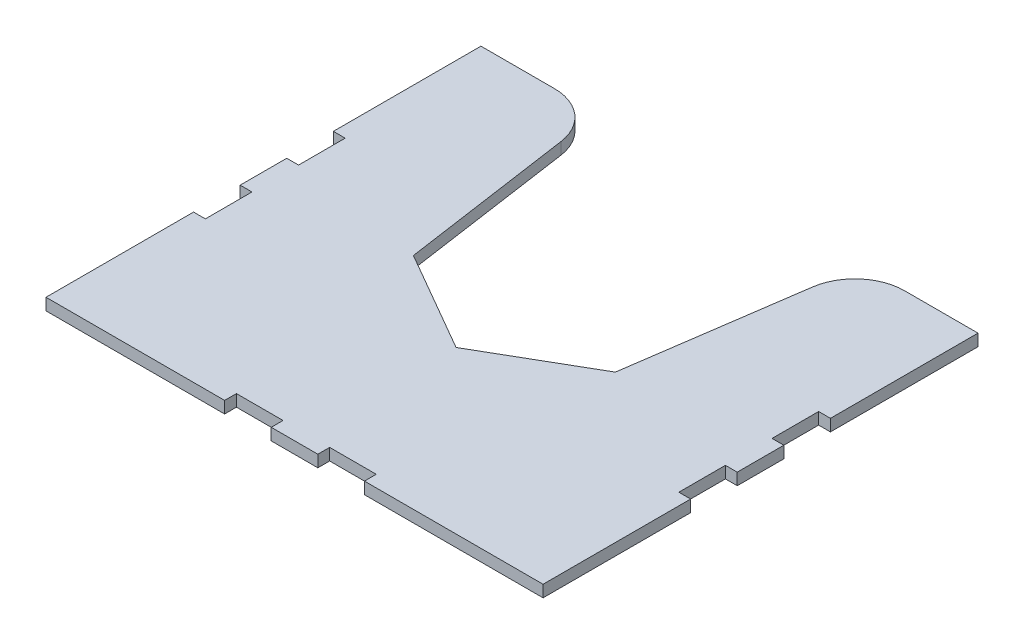
ISO-10303-21;
HEADER;
FILE_DESCRIPTION(('STEP AP214'),'2;1');
FILE_NAME('part.step','',(''),(''),'','','');
FILE_SCHEMA(('AUTOMOTIVE_DESIGN { 1 0 10303 214 1 1 1 1 }'));
ENDSEC;
DATA;
#1=APPLICATION_CONTEXT('core data for automotive mechanical design processes');
#2=APPLICATION_PROTOCOL_DEFINITION('international standard','automotive_design',2000,#1);
#3=PRODUCT_CONTEXT('',#1,'mechanical');
#4=PRODUCT('Part','Part','',(#3));
#5=PRODUCT_RELATED_PRODUCT_CATEGORY('part','',(#4));
#6=PRODUCT_DEFINITION_FORMATION('','',#4);
#7=PRODUCT_DEFINITION_CONTEXT('part definition',#1,'design');
#8=PRODUCT_DEFINITION('design','',#6,#7);
#9=PRODUCT_DEFINITION_SHAPE('','',#8);
#10=(LENGTH_UNIT() NAMED_UNIT(*) SI_UNIT(.MILLI.,.METRE.));
#11=(NAMED_UNIT(*) PLANE_ANGLE_UNIT() SI_UNIT($,.RADIAN.));
#12=(NAMED_UNIT(*) SI_UNIT($,.STERADIAN.) SOLID_ANGLE_UNIT());
#13=UNCERTAINTY_MEASURE_WITH_UNIT(LENGTH_MEASURE(1.E-05),#10,'distance_accuracy_value','');
#14=(GEOMETRIC_REPRESENTATION_CONTEXT(3) GLOBAL_UNCERTAINTY_ASSIGNED_CONTEXT((#13)) GLOBAL_UNIT_ASSIGNED_CONTEXT((#10,
#11,#12)) REPRESENTATION_CONTEXT('',''));
#15=CARTESIAN_POINT('',(0.,0.,0.));
#16=DIRECTION('',(0.,0.,1.));
#17=DIRECTION('',(1.,0.,0.));
#18=AXIS2_PLACEMENT_3D('',#15,#16,#17);
#19=CARTESIAN_POINT('',(0.,4.826,0.));
#20=DIRECTION('',(0.,0.,-1.));
#21=DIRECTION('',(-1.,0.,0.));
#22=AXIS2_PLACEMENT_3D('',#19,#20,#21);
#23=PLANE('',#22);
#24=DIRECTION('',(1.,0.,0.));
#25=VECTOR('',#24,1.);
#26=CARTESIAN_POINT('',(0.,0.,0.));
#27=LINE('',#26,#25);
#28=CARTESIAN_POINT('',(92.075,0.,0.));
#29=VERTEX_POINT('',#28);
#30=CARTESIAN_POINT('',(111.125,0.,0.));
#31=VERTEX_POINT('',#30);
#32=EDGE_CURVE('E274',#29,#31,#27,.T.);
#33=ORIENTED_EDGE('',*,*,#32,.T.);
#34=DIRECTION('',(0.,1.,0.));
#35=VECTOR('',#34,1.);
#36=CARTESIAN_POINT('',(111.125,0.,0.));
#37=LINE('',#36,#35);
#38=CARTESIAN_POINT('',(111.125,4.826,0.));
#39=VERTEX_POINT('',#38);
#40=EDGE_CURVE('E258',#31,#39,#37,.T.);
#41=ORIENTED_EDGE('',*,*,#40,.T.);
#42=DIRECTION('',(1.,0.,0.));
#43=VECTOR('',#42,1.);
#44=CARTESIAN_POINT('',(0.,4.826,0.));
#45=LINE('',#44,#43);
#46=CARTESIAN_POINT('',(92.075,4.826,0.));
#47=VERTEX_POINT('',#46);
#48=EDGE_CURVE('E369',#47,#39,#45,.T.);
#49=ORIENTED_EDGE('',*,*,#48,.F.);
#50=DIRECTION('',(0.,1.,0.));
#51=VECTOR('',#50,1.);
#52=CARTESIAN_POINT('',(92.075,0.,0.));
#53=LINE('',#52,#51);
#54=EDGE_CURVE('E280',#29,#47,#53,.T.);
#55=ORIENTED_EDGE('',*,*,#54,.F.);
#56=EDGE_LOOP('',(#33,#41,#49,#55));
#57=FACE_BOUND('',#56,.T.);
#58=ADVANCED_FACE('F32',(#57),#23,.F.);
#59=CARTESIAN_POINT('',(0.,0.,0.));
#60=VERTEX_POINT('',#59);
#61=CARTESIAN_POINT('',(73.025,0.,0.));
#62=VERTEX_POINT('',#61);
#63=EDGE_CURVE('E281',#60,#62,#27,.T.);
#64=ORIENTED_EDGE('',*,*,#63,.T.);
#65=DIRECTION('',(0.,1.,0.));
#66=VECTOR('',#65,1.);
#67=CARTESIAN_POINT('',(73.025,0.,0.));
#68=LINE('',#67,#66);
#69=CARTESIAN_POINT('',(73.025,4.826,0.));
#70=VERTEX_POINT('',#69);
#71=EDGE_CURVE('E462',#62,#70,#68,.T.);
#72=ORIENTED_EDGE('',*,*,#71,.T.);
#73=CARTESIAN_POINT('',(0.,4.826,0.));
#74=VERTEX_POINT('',#73);
#75=EDGE_CURVE('E365',#74,#70,#45,.T.);
#76=ORIENTED_EDGE('',*,*,#75,.F.);
#77=DIRECTION('',(0.,-1.,0.));
#78=VECTOR('',#77,1.);
#79=CARTESIAN_POINT('',(0.,4.826,0.));
#80=LINE('',#79,#78);
#81=EDGE_CURVE('E309',#74,#60,#80,.T.);
#82=ORIENTED_EDGE('',*,*,#81,.T.);
#83=EDGE_LOOP('',(#64,#72,#76,#82));
#84=FACE_BOUND('',#83,.T.);
#85=ADVANCED_FACE('F561',(#84),#23,.F.);
#86=CARTESIAN_POINT('',(203.2,4.826,0.));
#87=DIRECTION('',(-1.,0.,0.));
#88=DIRECTION('',(0.,0.,1.));
#89=AXIS2_PLACEMENT_3D('',#86,#87,#88);
#90=PLANE('',#89);
#91=DIRECTION('',(0.,0.,-1.));
#92=VECTOR('',#91,1.);
#93=CARTESIAN_POINT('',(203.2,0.,0.));
#94=LINE('',#93,#92);
#95=CARTESIAN_POINT('',(203.2,0.,-79.375));
#96=VERTEX_POINT('',#95);
#97=CARTESIAN_POINT('',(203.2,0.,-98.425));
#98=VERTEX_POINT('',#97);
#99=EDGE_CURVE('E294',#96,#98,#94,.T.);
#100=ORIENTED_EDGE('',*,*,#99,.T.);
#101=DIRECTION('',(0.,1.,0.));
#102=VECTOR('',#101,1.);
#103=CARTESIAN_POINT('',(203.2,0.,-98.425));
#104=LINE('',#103,#102);
#105=CARTESIAN_POINT('',(203.2,4.826,-98.425));
#106=VERTEX_POINT('',#105);
#107=EDGE_CURVE('E444',#98,#106,#104,.T.);
#108=ORIENTED_EDGE('',*,*,#107,.T.);
#109=DIRECTION('',(0.,0.,-1.));
#110=VECTOR('',#109,1.);
#111=CARTESIAN_POINT('',(203.2,4.826,0.));
#112=LINE('',#111,#110);
#113=CARTESIAN_POINT('',(203.2,4.826,-79.375));
#114=VERTEX_POINT('',#113);
#115=EDGE_CURVE('E373',#114,#106,#112,.T.);
#116=ORIENTED_EDGE('',*,*,#115,.F.);
#117=DIRECTION('',(0.,1.,0.));
#118=VECTOR('',#117,1.);
#119=CARTESIAN_POINT('',(203.2,0.,-79.375));
#120=LINE('',#119,#118);
#121=EDGE_CURVE('E446',#96,#114,#120,.T.);
#122=ORIENTED_EDGE('',*,*,#121,.F.);
#123=EDGE_LOOP('',(#100,#108,#116,#122));
#124=FACE_BOUND('',#123,.T.);
#125=ADVANCED_FACE('F442',(#124),#90,.F.);
#126=CARTESIAN_POINT('',(203.2,0.,0.));
#127=VERTEX_POINT('',#126);
#128=CARTESIAN_POINT('',(203.2,0.,-60.325));
#129=VERTEX_POINT('',#128);
#130=EDGE_CURVE('E290',#127,#129,#94,.T.);
#131=ORIENTED_EDGE('',*,*,#130,.T.);
#132=DIRECTION('',(0.,1.,0.));
#133=VECTOR('',#132,1.);
#134=CARTESIAN_POINT('',(203.2,0.,-60.325));
#135=LINE('',#134,#133);
#136=CARTESIAN_POINT('',(203.2,4.826,-60.325));
#137=VERTEX_POINT('',#136);
#138=EDGE_CURVE('E486',#129,#137,#135,.T.);
#139=ORIENTED_EDGE('',*,*,#138,.T.);
#140=CARTESIAN_POINT('',(203.2,4.826,0.));
#141=VERTEX_POINT('',#140);
#142=EDGE_CURVE('E370',#141,#137,#112,.T.);
#143=ORIENTED_EDGE('',*,*,#142,.F.);
#144=DIRECTION('',(0.,-1.,0.));
#145=VECTOR('',#144,1.);
#146=CARTESIAN_POINT('',(203.2,4.826,0.));
#147=LINE('',#146,#145);
#148=EDGE_CURVE('E306',#141,#127,#147,.T.);
#149=ORIENTED_EDGE('',*,*,#148,.T.);
#150=EDGE_LOOP('',(#131,#139,#143,#149));
#151=FACE_BOUND('',#150,.T.);
#152=ADVANCED_FACE('F605',(#151),#90,.F.);
#153=CARTESIAN_POINT('',(0.,4.826,0.));
#154=DIRECTION('',(1.,0.,0.));
#155=DIRECTION('',(0.,0.,-1.));
#156=AXIS2_PLACEMENT_3D('',#153,#154,#155);
#157=PLANE('',#156);
#158=DIRECTION('',(0.,0.,1.));
#159=VECTOR('',#158,1.);
#160=CARTESIAN_POINT('',(0.,0.,0.));
#161=LINE('',#160,#159);
#162=CARTESIAN_POINT('',(0.,0.,-98.425));
#163=VERTEX_POINT('',#162);
#164=CARTESIAN_POINT('',(0.,0.,-79.375));
#165=VERTEX_POINT('',#164);
#166=EDGE_CURVE('E565',#163,#165,#161,.T.);
#167=ORIENTED_EDGE('',*,*,#166,.T.);
#168=DIRECTION('',(0.,1.,0.));
#169=VECTOR('',#168,1.);
#170=CARTESIAN_POINT('',(0.,0.,-79.375));
#171=LINE('',#170,#169);
#172=CARTESIAN_POINT('',(0.,4.826,-79.375));
#173=VERTEX_POINT('',#172);
#174=EDGE_CURVE('E518',#165,#173,#171,.T.);
#175=ORIENTED_EDGE('',*,*,#174,.T.);
#176=DIRECTION('',(0.,0.,1.));
#177=VECTOR('',#176,1.);
#178=CARTESIAN_POINT('',(0.,4.826,0.));
#179=LINE('',#178,#177);
#180=CARTESIAN_POINT('',(0.,4.826,-98.425));
#181=VERTEX_POINT('',#180);
#182=EDGE_CURVE('E364',#181,#173,#179,.T.);
#183=ORIENTED_EDGE('',*,*,#182,.F.);
#184=DIRECTION('',(0.,1.,0.));
#185=VECTOR('',#184,1.);
#186=CARTESIAN_POINT('',(0.,0.,-98.425));
#187=LINE('',#186,#185);
#188=EDGE_CURVE('E402',#163,#181,#187,.T.);
#189=ORIENTED_EDGE('',*,*,#188,.F.);
#190=EDGE_LOOP('',(#167,#175,#183,#189));
#191=FACE_BOUND('',#190,.T.);
#192=ADVANCED_FACE('F549',(#191),#157,.F.);
#193=CARTESIAN_POINT('',(0.,0.,-177.8));
#194=VERTEX_POINT('',#193);
#195=CARTESIAN_POINT('',(0.,0.,-117.475));
#196=VERTEX_POINT('',#195);
#197=EDGE_CURVE('E286',#194,#196,#161,.T.);
#198=ORIENTED_EDGE('',*,*,#197,.T.);
#199=DIRECTION('',(0.,1.,0.));
#200=VECTOR('',#199,1.);
#201=CARTESIAN_POINT('',(0.,0.,-117.475));
#202=LINE('',#201,#200);
#203=CARTESIAN_POINT('',(0.,4.826,-117.475));
#204=VERTEX_POINT('',#203);
#205=EDGE_CURVE('E388',#196,#204,#202,.T.);
#206=ORIENTED_EDGE('',*,*,#205,.T.);
#207=CARTESIAN_POINT('',(0.,4.826,-177.8));
#208=VERTEX_POINT('',#207);
#209=EDGE_CURVE('E360',#208,#204,#179,.T.);
#210=ORIENTED_EDGE('',*,*,#209,.F.);
#211=DIRECTION('',(0.,-1.,0.));
#212=VECTOR('',#211,1.);
#213=CARTESIAN_POINT('',(0.,4.826,-177.8));
#214=LINE('',#213,#212);
#215=EDGE_CURVE('E299',#208,#194,#214,.T.);
#216=ORIENTED_EDGE('',*,*,#215,.T.);
#217=EDGE_LOOP('',(#198,#206,#210,#216));
#218=FACE_BOUND('',#217,.T.);
#219=ADVANCED_FACE('F387',(#218),#157,.F.);
#220=CARTESIAN_POINT('',(0.,4.826,-177.8));
#221=DIRECTION('',(0.,0.,1.));
#222=DIRECTION('',(1.,0.,0.));
#223=AXIS2_PLACEMENT_3D('',#220,#221,#222);
#224=PLANE('',#223);
#225=DIRECTION('',(-1.,0.,0.));
#226=VECTOR('',#225,1.);
#227=CARTESIAN_POINT('',(0.,4.826,-177.8));
#228=LINE('',#227,#226);
#229=CARTESIAN_POINT('',(30.0290309064898,4.826,-177.8));
#230=VERTEX_POINT('',#229);
#231=EDGE_CURVE('E372',#230,#208,#228,.T.);
#232=ORIENTED_EDGE('',*,*,#231,.F.);
#233=DIRECTION('',(0.,1.,0.));
#234=VECTOR('',#233,1.);
#235=CARTESIAN_POINT('',(30.0290309064898,4.826,-177.8));
#236=LINE('',#235,#234);
#237=CARTESIAN_POINT('',(30.0290309064898,0.,-177.8));
#238=VERTEX_POINT('',#237);
#239=EDGE_CURVE('E11',#230,#238,#236,.F.);
#240=ORIENTED_EDGE('',*,*,#239,.T.);
#241=DIRECTION('',(-1.,0.,0.));
#242=VECTOR('',#241,1.);
#243=CARTESIAN_POINT('',(0.,0.,-177.8));
#244=LINE('',#243,#242);
#245=EDGE_CURVE('E293',#238,#194,#244,.T.);
#246=ORIENTED_EDGE('',*,*,#245,.T.);
#247=ORIENTED_EDGE('',*,*,#215,.F.);
#248=EDGE_LOOP('',(#232,#240,#246,#247));
#249=FACE_BOUND('',#248,.T.);
#250=ADVANCED_FACE('F381',(#249),#224,.F.);
#251=CARTESIAN_POINT('',(0.,4.826,-60.325));
#252=VERTEX_POINT('',#251);
#253=EDGE_CURVE('E298',#252,#74,#179,.T.);
#254=ORIENTED_EDGE('',*,*,#253,.F.);
#255=DIRECTION('',(0.,1.,0.));
#256=VECTOR('',#255,1.);
#257=CARTESIAN_POINT('',(0.,0.,-60.325));
#258=LINE('',#257,#256);
#259=CARTESIAN_POINT('',(0.,0.,-60.325));
#260=VERTEX_POINT('',#259);
#261=EDGE_CURVE('E511',#260,#252,#258,.T.);
#262=ORIENTED_EDGE('',*,*,#261,.F.);
#263=EDGE_CURVE('E354',#260,#60,#161,.T.);
#264=ORIENTED_EDGE('',*,*,#263,.T.);
#265=ORIENTED_EDGE('',*,*,#81,.F.);
#266=EDGE_LOOP('',(#254,#262,#264,#265));
#267=FACE_BOUND('',#266,.T.);
#268=ADVANCED_FACE('F562',(#267),#157,.F.);
#269=CARTESIAN_POINT('',(130.175,4.826,0.));
#270=VERTEX_POINT('',#269);
#271=EDGE_CURVE('E363',#270,#141,#45,.T.);
#272=ORIENTED_EDGE('',*,*,#271,.F.);
#273=DIRECTION('',(0.,1.,0.));
#274=VECTOR('',#273,1.);
#275=CARTESIAN_POINT('',(130.175,0.,0.));
#276=LINE('',#275,#274);
#277=CARTESIAN_POINT('',(130.175,0.,0.));
#278=VERTEX_POINT('',#277);
#279=EDGE_CURVE('E268',#278,#270,#276,.T.);
#280=ORIENTED_EDGE('',*,*,#279,.F.);
#281=EDGE_CURVE('E282',#278,#127,#27,.T.);
#282=ORIENTED_EDGE('',*,*,#281,.T.);
#283=ORIENTED_EDGE('',*,*,#148,.F.);
#284=EDGE_LOOP('',(#272,#280,#282,#283));
#285=FACE_BOUND('',#284,.T.);
#286=ADVANCED_FACE('F601',(#285),#23,.F.);
#287=CARTESIAN_POINT('',(203.2,4.826,-117.475));
#288=VERTEX_POINT('',#287);
#289=CARTESIAN_POINT('',(203.2,4.826,-177.8));
#290=VERTEX_POINT('',#289);
#291=EDGE_CURVE('E368',#288,#290,#112,.T.);
#292=ORIENTED_EDGE('',*,*,#291,.F.);
#293=DIRECTION('',(0.,1.,0.));
#294=VECTOR('',#293,1.);
#295=CARTESIAN_POINT('',(203.2,0.,-117.475));
#296=LINE('',#295,#294);
#297=CARTESIAN_POINT('',(203.2,0.,-117.475));
#298=VERTEX_POINT('',#297);
#299=EDGE_CURVE('E476',#298,#288,#296,.T.);
#300=ORIENTED_EDGE('',*,*,#299,.F.);
#301=CARTESIAN_POINT('',(203.2,0.,-177.8));
#302=VERTEX_POINT('',#301);
#303=EDGE_CURVE('E285',#298,#302,#94,.T.);
#304=ORIENTED_EDGE('',*,*,#303,.T.);
#305=DIRECTION('',(0.,-1.,0.));
#306=VECTOR('',#305,1.);
#307=CARTESIAN_POINT('',(203.2,4.826,-177.8));
#308=LINE('',#307,#306);
#309=EDGE_CURVE('E302',#290,#302,#308,.T.);
#310=ORIENTED_EDGE('',*,*,#309,.F.);
#311=EDGE_LOOP('',(#292,#300,#304,#310));
#312=FACE_BOUND('',#311,.T.);
#313=ADVANCED_FACE('F620',(#312),#90,.F.);
#314=CARTESIAN_POINT('',(173.17096909351,0.,-177.8));
#315=VERTEX_POINT('',#314);
#316=EDGE_CURVE('E295',#302,#315,#244,.T.);
#317=ORIENTED_EDGE('',*,*,#316,.T.);
#318=DIRECTION('',(0.,1.,0.));
#319=VECTOR('',#318,1.);
#320=CARTESIAN_POINT('',(173.17096909351,4.826,-177.8));
#321=LINE('',#320,#319);
#322=CARTESIAN_POINT('',(173.17096909351,4.826,-177.8));
#323=VERTEX_POINT('',#322);
#324=EDGE_CURVE('E312',#315,#323,#321,.T.);
#325=ORIENTED_EDGE('',*,*,#324,.T.);
#326=EDGE_CURVE('E303',#290,#323,#228,.T.);
#327=ORIENTED_EDGE('',*,*,#326,.F.);
#328=ORIENTED_EDGE('',*,*,#309,.T.);
#329=EDGE_LOOP('',(#317,#325,#327,#328));
#330=FACE_BOUND('',#329,.T.);
#331=ADVANCED_FACE('F429',(#330),#224,.F.);
#332=CARTESIAN_POINT('',(0.,4.826,0.));
#333=DIRECTION('',(0.,-1.,0.));
#334=DIRECTION('',(0.,0.,-1.));
#335=AXIS2_PLACEMENT_3D('',#332,#333,#334);
#336=PLANE('',#335);
#337=ORIENTED_EDGE('',*,*,#48,.T.);
#338=DIRECTION('',(0.,0.,1.));
#339=VECTOR('',#338,1.);
#340=CARTESIAN_POINT('',(111.125,4.826,0.));
#341=LINE('',#340,#339);
#342=CARTESIAN_POINT('',(111.125,4.826,-4.826));
#343=VERTEX_POINT('',#342);
#344=EDGE_CURVE('E263',#343,#39,#341,.T.);
#345=ORIENTED_EDGE('',*,*,#344,.F.);
#346=DIRECTION('',(-1.,0.,0.));
#347=VECTOR('',#346,1.);
#348=CARTESIAN_POINT('',(111.125,4.826,-4.826));
#349=LINE('',#348,#347);
#350=CARTESIAN_POINT('',(130.175,4.826,-4.826));
#351=VERTEX_POINT('',#350);
#352=EDGE_CURVE('E277',#351,#343,#349,.T.);
#353=ORIENTED_EDGE('',*,*,#352,.F.);
#354=DIRECTION('',(0.,0.,-1.));
#355=VECTOR('',#354,1.);
#356=CARTESIAN_POINT('',(130.175,4.826,0.));
#357=LINE('',#356,#355);
#358=EDGE_CURVE('E598',#270,#351,#357,.T.);
#359=ORIENTED_EDGE('',*,*,#358,.F.);
#360=ORIENTED_EDGE('',*,*,#271,.T.);
#361=ORIENTED_EDGE('',*,*,#142,.T.);
#362=DIRECTION('',(1.,0.,0.));
#363=VECTOR('',#362,1.);
#364=CARTESIAN_POINT('',(203.2,4.826,-60.325));
#365=LINE('',#364,#363);
#366=CARTESIAN_POINT('',(198.374,4.826,-60.325));
#367=VERTEX_POINT('',#366);
#368=EDGE_CURVE('E473',#367,#137,#365,.T.);
#369=ORIENTED_EDGE('',*,*,#368,.F.);
#370=DIRECTION('',(0.,0.,1.));
#371=VECTOR('',#370,1.);
#372=CARTESIAN_POINT('',(198.374,4.826,-79.375));
#373=LINE('',#372,#371);
#374=CARTESIAN_POINT('',(198.374,4.826,-79.375));
#375=VERTEX_POINT('',#374);
#376=EDGE_CURVE('E482',#375,#367,#373,.T.);
#377=ORIENTED_EDGE('',*,*,#376,.F.);
#378=DIRECTION('',(-1.,0.,0.));
#379=VECTOR('',#378,1.);
#380=CARTESIAN_POINT('',(203.2,4.826,-79.375));
#381=LINE('',#380,#379);
#382=EDGE_CURVE('E488',#114,#375,#381,.T.);
#383=ORIENTED_EDGE('',*,*,#382,.F.);
#384=ORIENTED_EDGE('',*,*,#115,.T.);
#385=DIRECTION('',(1.,0.,0.));
#386=VECTOR('',#385,1.);
#387=CARTESIAN_POINT('',(203.2,4.826,-98.425));
#388=LINE('',#387,#386);
#389=CARTESIAN_POINT('',(198.374,4.826,-98.425));
#390=VERTEX_POINT('',#389);
#391=EDGE_CURVE('E466',#390,#106,#388,.T.);
#392=ORIENTED_EDGE('',*,*,#391,.F.);
#393=DIRECTION('',(0.,0.,1.));
#394=VECTOR('',#393,1.);
#395=CARTESIAN_POINT('',(198.374,4.826,-117.475));
#396=LINE('',#395,#394);
#397=CARTESIAN_POINT('',(198.374,4.826,-117.475));
#398=VERTEX_POINT('',#397);
#399=EDGE_CURVE('E455',#398,#390,#396,.T.);
#400=ORIENTED_EDGE('',*,*,#399,.F.);
#401=DIRECTION('',(-1.,0.,0.));
#402=VECTOR('',#401,1.);
#403=CARTESIAN_POINT('',(203.2,4.826,-117.475));
#404=LINE('',#403,#402);
#405=EDGE_CURVE('E459',#288,#398,#404,.T.);
#406=ORIENTED_EDGE('',*,*,#405,.F.);
#407=ORIENTED_EDGE('',*,*,#291,.T.);
#408=ORIENTED_EDGE('',*,*,#326,.T.);
#409=CARTESIAN_POINT('',(173.17096909351,4.826,-157.48));
#410=DIRECTION('',(0.,-1.,0.));
#411=DIRECTION('',(0.,0.,-1.));
#412=AXIS2_PLACEMENT_3D('',#409,#410,#411);
#413=CIRCLE('',#412,20.32);
#414=CARTESIAN_POINT('',(153.059657140254,4.826,-160.384742935067));
#415=VERTEX_POINT('',#414);
#416=EDGE_CURVE('E317',#323,#415,#413,.F.);
#417=ORIENTED_EDGE('',*,*,#416,.T.);
#418=DIRECTION('',(0.142949947591888,0.,-0.989729918959449));
#419=VECTOR('',#418,1.);
#420=CARTESIAN_POINT('',(155.575,4.826,-177.8));
#421=LINE('',#420,#419);
#422=CARTESIAN_POINT('',(142.875,4.826,-89.8701323608018));
#423=VERTEX_POINT('',#422);
#424=EDGE_CURVE('E343',#423,#415,#421,.T.);
#425=ORIENTED_EDGE('',*,*,#424,.F.);
#426=DIRECTION('',(0.866025403784438,0.,-0.500000000000001));
#427=VECTOR('',#426,1.);
#428=CARTESIAN_POINT('',(101.6,4.826,-66.04));
#429=LINE('',#428,#427);
#430=CARTESIAN_POINT('',(101.6,4.826,-66.04));
#431=VERTEX_POINT('',#430);
#432=EDGE_CURVE('E348',#431,#423,#429,.T.);
#433=ORIENTED_EDGE('',*,*,#432,.F.);
#434=DIRECTION('',(0.866025403784438,0.,0.500000000000001));
#435=VECTOR('',#434,1.);
#436=CARTESIAN_POINT('',(60.325,4.826,-89.8701323608018));
#437=LINE('',#436,#435);
#438=CARTESIAN_POINT('',(60.325,4.826,-89.8701323608018));
#439=VERTEX_POINT('',#438);
#440=EDGE_CURVE('E342',#439,#431,#437,.T.);
#441=ORIENTED_EDGE('',*,*,#440,.F.);
#442=DIRECTION('',(0.142949947591888,0.,0.989729918959449));
#443=VECTOR('',#442,1.);
#444=CARTESIAN_POINT('',(60.325,4.826,-89.8701323608018));
#445=LINE('',#444,#443);
#446=CARTESIAN_POINT('',(50.1403428597458,4.826,-160.384742935067));
#447=VERTEX_POINT('',#446);
#448=EDGE_CURVE('E331',#447,#439,#445,.T.);
#449=ORIENTED_EDGE('',*,*,#448,.F.);
#450=CARTESIAN_POINT('',(30.0290309064898,4.826,-157.48));
#451=DIRECTION('',(0.,-1.,0.));
#452=DIRECTION('',(0.,0.,-1.));
#453=AXIS2_PLACEMENT_3D('',#450,#451,#452);
#454=CIRCLE('',#453,20.32);
#455=EDGE_CURVE('E315',#447,#230,#454,.F.);
#456=ORIENTED_EDGE('',*,*,#455,.T.);
#457=ORIENTED_EDGE('',*,*,#231,.T.);
#458=ORIENTED_EDGE('',*,*,#209,.T.);
#459=DIRECTION('',(-1.,0.,0.));
#460=VECTOR('',#459,1.);
#461=CARTESIAN_POINT('',(0.,4.826,-117.475));
#462=LINE('',#461,#460);
#463=CARTESIAN_POINT('',(4.826,4.826,-117.475));
#464=VERTEX_POINT('',#463);
#465=EDGE_CURVE('E398',#464,#204,#462,.T.);
#466=ORIENTED_EDGE('',*,*,#465,.F.);
#467=DIRECTION('',(0.,0.,-1.));
#468=VECTOR('',#467,1.);
#469=CARTESIAN_POINT('',(4.826,4.826,-117.475));
#470=LINE('',#469,#468);
#471=CARTESIAN_POINT('',(4.826,4.826,-98.425));
#472=VERTEX_POINT('',#471);
#473=EDGE_CURVE('E535',#472,#464,#470,.T.);
#474=ORIENTED_EDGE('',*,*,#473,.F.);
#475=DIRECTION('',(1.,0.,0.));
#476=VECTOR('',#475,1.);
#477=CARTESIAN_POINT('',(0.,4.826,-98.425));
#478=LINE('',#477,#476);
#479=EDGE_CURVE('E521',#181,#472,#478,.T.);
#480=ORIENTED_EDGE('',*,*,#479,.F.);
#481=ORIENTED_EDGE('',*,*,#182,.T.);
#482=DIRECTION('',(-1.,0.,0.));
#483=VECTOR('',#482,1.);
#484=CARTESIAN_POINT('',(0.,4.826,-79.375));
#485=LINE('',#484,#483);
#486=CARTESIAN_POINT('',(4.82600000000001,4.826,-79.375));
#487=VERTEX_POINT('',#486);
#488=EDGE_CURVE('E505',#487,#173,#485,.T.);
#489=ORIENTED_EDGE('',*,*,#488,.F.);
#490=DIRECTION('',(0.,0.,-1.));
#491=VECTOR('',#490,1.);
#492=CARTESIAN_POINT('',(4.82600000000001,4.826,-79.375));
#493=LINE('',#492,#491);
#494=CARTESIAN_POINT('',(4.826,4.826,-60.325));
#495=VERTEX_POINT('',#494);
#496=EDGE_CURVE('E514',#495,#487,#493,.T.);
#497=ORIENTED_EDGE('',*,*,#496,.F.);
#498=DIRECTION('',(1.,0.,0.));
#499=VECTOR('',#498,1.);
#500=CARTESIAN_POINT('',(0.,4.826,-60.325));
#501=LINE('',#500,#499);
#502=EDGE_CURVE('E495',#252,#495,#501,.T.);
#503=ORIENTED_EDGE('',*,*,#502,.F.);
#504=ORIENTED_EDGE('',*,*,#253,.T.);
#505=ORIENTED_EDGE('',*,*,#75,.T.);
#506=DIRECTION('',(0.,0.,1.));
#507=VECTOR('',#506,1.);
#508=CARTESIAN_POINT('',(73.025,4.826,0.));
#509=LINE('',#508,#507);
#510=CARTESIAN_POINT('',(73.025,4.826,-4.826));
#511=VERTEX_POINT('',#510);
#512=EDGE_CURVE('E580',#511,#70,#509,.T.);
#513=ORIENTED_EDGE('',*,*,#512,.F.);
#514=DIRECTION('',(-1.,0.,0.));
#515=VECTOR('',#514,1.);
#516=CARTESIAN_POINT('',(73.025,4.826,-4.826));
#517=LINE('',#516,#515);
#518=CARTESIAN_POINT('',(92.075,4.826,-4.826));
#519=VERTEX_POINT('',#518);
#520=EDGE_CURVE('E571',#519,#511,#517,.T.);
#521=ORIENTED_EDGE('',*,*,#520,.F.);
#522=DIRECTION('',(0.,0.,-1.));
#523=VECTOR('',#522,1.);
#524=CARTESIAN_POINT('',(92.075,4.826,0.));
#525=LINE('',#524,#523);
#526=EDGE_CURVE('E575',#47,#519,#525,.T.);
#527=ORIENTED_EDGE('',*,*,#526,.F.);
#528=EDGE_LOOP('',(#337,#345,#353,#359,#360,#361,#369,#377,#383,#384,#392,#400,#406,#407,#408,
#417,#425,#433,#441,#449,#456,#457,#458,#466,#474,#480,#481,#489,#497,#503,#504,#505,#513,#521,#527));
#529=FACE_BOUND('',#528,.T.);
#530=ADVANCED_FACE('F338',(#529),#336,.F.);
#531=CARTESIAN_POINT('',(0.,0.,0.));
#532=DIRECTION('',(0.,-1.,0.));
#533=DIRECTION('',(0.,0.,-1.));
#534=AXIS2_PLACEMENT_3D('',#531,#532,#533);
#535=PLANE('',#534);
#536=DIRECTION('',(0.,0.,1.));
#537=VECTOR('',#536,1.);
#538=CARTESIAN_POINT('',(111.125,0.,0.));
#539=LINE('',#538,#537);
#540=CARTESIAN_POINT('',(111.125,0.,-4.826));
#541=VERTEX_POINT('',#540);
#542=EDGE_CURVE('E261',#541,#31,#539,.T.);
#543=ORIENTED_EDGE('',*,*,#542,.T.);
#544=ORIENTED_EDGE('',*,*,#32,.F.);
#545=DIRECTION('',(0.,0.,-1.));
#546=VECTOR('',#545,1.);
#547=CARTESIAN_POINT('',(92.075,0.,0.));
#548=LINE('',#547,#546);
#549=CARTESIAN_POINT('',(92.075,0.,-4.826));
#550=VERTEX_POINT('',#549);
#551=EDGE_CURVE('E570',#29,#550,#548,.T.);
#552=ORIENTED_EDGE('',*,*,#551,.T.);
#553=DIRECTION('',(-1.,0.,0.));
#554=VECTOR('',#553,1.);
#555=CARTESIAN_POINT('',(73.025,0.,-4.826));
#556=LINE('',#555,#554);
#557=CARTESIAN_POINT('',(73.025,0.,-4.826));
#558=VERTEX_POINT('',#557);
#559=EDGE_CURVE('E55',#550,#558,#556,.T.);
#560=ORIENTED_EDGE('',*,*,#559,.T.);
#561=DIRECTION('',(0.,0.,1.));
#562=VECTOR('',#561,1.);
#563=CARTESIAN_POINT('',(73.025,0.,0.));
#564=LINE('',#563,#562);
#565=EDGE_CURVE('E568',#558,#62,#564,.T.);
#566=ORIENTED_EDGE('',*,*,#565,.T.);
#567=ORIENTED_EDGE('',*,*,#63,.F.);
#568=ORIENTED_EDGE('',*,*,#263,.F.);
#569=DIRECTION('',(1.,0.,0.));
#570=VECTOR('',#569,1.);
#571=CARTESIAN_POINT('',(0.,0.,-60.325));
#572=LINE('',#571,#570);
#573=CARTESIAN_POINT('',(4.826,0.,-60.325));
#574=VERTEX_POINT('',#573);
#575=EDGE_CURVE('E501',#260,#574,#572,.T.);
#576=ORIENTED_EDGE('',*,*,#575,.T.);
#577=DIRECTION('',(0.,0.,-1.));
#578=VECTOR('',#577,1.);
#579=CARTESIAN_POINT('',(4.82600000000001,0.,-79.375));
#580=LINE('',#579,#578);
#581=CARTESIAN_POINT('',(4.82600000000001,0.,-79.375));
#582=VERTEX_POINT('',#581);
#583=EDGE_CURVE('E504',#574,#582,#580,.T.);
#584=ORIENTED_EDGE('',*,*,#583,.T.);
#585=DIRECTION('',(-1.,0.,0.));
#586=VECTOR('',#585,1.);
#587=CARTESIAN_POINT('',(0.,0.,-79.375));
#588=LINE('',#587,#586);
#589=EDGE_CURVE('E508',#582,#165,#588,.T.);
#590=ORIENTED_EDGE('',*,*,#589,.T.);
#591=ORIENTED_EDGE('',*,*,#166,.F.);
#592=DIRECTION('',(1.,0.,0.));
#593=VECTOR('',#592,1.);
#594=CARTESIAN_POINT('',(0.,0.,-98.425));
#595=LINE('',#594,#593);
#596=CARTESIAN_POINT('',(4.826,0.,-98.425));
#597=VERTEX_POINT('',#596);
#598=EDGE_CURVE('E527',#163,#597,#595,.T.);
#599=ORIENTED_EDGE('',*,*,#598,.T.);
#600=DIRECTION('',(0.,0.,-1.));
#601=VECTOR('',#600,1.);
#602=CARTESIAN_POINT('',(4.826,0.,-117.475));
#603=LINE('',#602,#601);
#604=CARTESIAN_POINT('',(4.826,0.,-117.475));
#605=VERTEX_POINT('',#604);
#606=EDGE_CURVE('E530',#597,#605,#603,.T.);
#607=ORIENTED_EDGE('',*,*,#606,.T.);
#608=DIRECTION('',(-1.,0.,0.));
#609=VECTOR('',#608,1.);
#610=CARTESIAN_POINT('',(0.,0.,-117.475));
#611=LINE('',#610,#609);
#612=EDGE_CURVE('E404',#605,#196,#611,.T.);
#613=ORIENTED_EDGE('',*,*,#612,.T.);
#614=ORIENTED_EDGE('',*,*,#197,.F.);
#615=ORIENTED_EDGE('',*,*,#245,.F.);
#616=CARTESIAN_POINT('',(30.0290309064898,0.,-157.48));
#617=DIRECTION('',(0.,-1.,0.));
#618=DIRECTION('',(0.,0.,-1.));
#619=AXIS2_PLACEMENT_3D('',#616,#617,#618);
#620=CIRCLE('',#619,20.32);
#621=CARTESIAN_POINT('',(50.1403428597458,0.,-160.384742935067));
#622=VERTEX_POINT('',#621);
#623=EDGE_CURVE('E321',#238,#622,#620,.T.);
#624=ORIENTED_EDGE('',*,*,#623,.T.);
#625=DIRECTION('',(0.142949947591888,0.,0.989729918959449));
#626=VECTOR('',#625,1.);
#627=CARTESIAN_POINT('',(60.325,0.,-89.8701323608018));
#628=LINE('',#627,#626);
#629=CARTESIAN_POINT('',(60.325,0.,-89.8701323608018));
#630=VERTEX_POINT('',#629);
#631=EDGE_CURVE('E333',#622,#630,#628,.T.);
#632=ORIENTED_EDGE('',*,*,#631,.T.);
#633=DIRECTION('',(0.866025403784438,0.,0.500000000000001));
#634=VECTOR('',#633,1.);
#635=CARTESIAN_POINT('',(60.325,0.,-89.8701323608018));
#636=LINE('',#635,#634);
#637=CARTESIAN_POINT('',(101.6,0.,-66.04));
#638=VERTEX_POINT('',#637);
#639=EDGE_CURVE('E359',#630,#638,#636,.T.);
#640=ORIENTED_EDGE('',*,*,#639,.T.);
#641=DIRECTION('',(0.866025403784438,0.,-0.500000000000001));
#642=VECTOR('',#641,1.);
#643=CARTESIAN_POINT('',(101.6,0.,-66.04));
#644=LINE('',#643,#642);
#645=CARTESIAN_POINT('',(142.875,0.,-89.8701323608018));
#646=VERTEX_POINT('',#645);
#647=EDGE_CURVE('E345',#638,#646,#644,.T.);
#648=ORIENTED_EDGE('',*,*,#647,.T.);
#649=DIRECTION('',(0.142949947591888,0.,-0.989729918959449));
#650=VECTOR('',#649,1.);
#651=CARTESIAN_POINT('',(155.575,0.,-177.8));
#652=LINE('',#651,#650);
#653=CARTESIAN_POINT('',(153.059657140254,0.,-160.384742935067));
#654=VERTEX_POINT('',#653);
#655=EDGE_CURVE('E407',#646,#654,#652,.T.);
#656=ORIENTED_EDGE('',*,*,#655,.T.);
#657=CARTESIAN_POINT('',(173.17096909351,0.,-157.48));
#658=DIRECTION('',(0.,-1.,0.));
#659=DIRECTION('',(0.,0.,-1.));
#660=AXIS2_PLACEMENT_3D('',#657,#658,#659);
#661=CIRCLE('',#660,20.32);
#662=EDGE_CURVE('E323',#654,#315,#661,.T.);
#663=ORIENTED_EDGE('',*,*,#662,.T.);
#664=ORIENTED_EDGE('',*,*,#316,.F.);
#665=ORIENTED_EDGE('',*,*,#303,.F.);
#666=DIRECTION('',(-1.,0.,0.));
#667=VECTOR('',#666,1.);
#668=CARTESIAN_POINT('',(203.2,0.,-117.475));
#669=LINE('',#668,#667);
#670=CARTESIAN_POINT('',(198.374,0.,-117.475));
#671=VERTEX_POINT('',#670);
#672=EDGE_CURVE('E434',#298,#671,#669,.T.);
#673=ORIENTED_EDGE('',*,*,#672,.T.);
#674=DIRECTION('',(0.,0.,1.));
#675=VECTOR('',#674,1.);
#676=CARTESIAN_POINT('',(198.374,0.,-117.475));
#677=LINE('',#676,#675);
#678=CARTESIAN_POINT('',(198.374,0.,-98.425));
#679=VERTEX_POINT('',#678);
#680=EDGE_CURVE('E453',#671,#679,#677,.T.);
#681=ORIENTED_EDGE('',*,*,#680,.T.);
#682=DIRECTION('',(1.,0.,0.));
#683=VECTOR('',#682,1.);
#684=CARTESIAN_POINT('',(203.2,0.,-98.425));
#685=LINE('',#684,#683);
#686=EDGE_CURVE('E452',#679,#98,#685,.T.);
#687=ORIENTED_EDGE('',*,*,#686,.T.);
#688=ORIENTED_EDGE('',*,*,#99,.F.);
#689=DIRECTION('',(-1.,0.,0.));
#690=VECTOR('',#689,1.);
#691=CARTESIAN_POINT('',(203.2,0.,-79.375));
#692=LINE('',#691,#690);
#693=CARTESIAN_POINT('',(198.374,0.,-79.375));
#694=VERTEX_POINT('',#693);
#695=EDGE_CURVE('E450',#96,#694,#692,.T.);
#696=ORIENTED_EDGE('',*,*,#695,.T.);
#697=DIRECTION('',(0.,0.,1.));
#698=VECTOR('',#697,1.);
#699=CARTESIAN_POINT('',(198.374,0.,-79.375));
#700=LINE('',#699,#698);
#701=CARTESIAN_POINT('',(198.374,0.,-60.325));
#702=VERTEX_POINT('',#701);
#703=EDGE_CURVE('E484',#694,#702,#700,.T.);
#704=ORIENTED_EDGE('',*,*,#703,.T.);
#705=DIRECTION('',(1.,0.,0.));
#706=VECTOR('',#705,1.);
#707=CARTESIAN_POINT('',(203.2,0.,-60.325));
#708=LINE('',#707,#706);
#709=EDGE_CURVE('E479',#702,#129,#708,.T.);
#710=ORIENTED_EDGE('',*,*,#709,.T.);
#711=ORIENTED_EDGE('',*,*,#130,.F.);
#712=ORIENTED_EDGE('',*,*,#281,.F.);
#713=DIRECTION('',(0.,0.,-1.));
#714=VECTOR('',#713,1.);
#715=CARTESIAN_POINT('',(130.175,0.,0.));
#716=LINE('',#715,#714);
#717=CARTESIAN_POINT('',(130.175,0.,-4.826));
#718=VERTEX_POINT('',#717);
#719=EDGE_CURVE('E276',#278,#718,#716,.T.);
#720=ORIENTED_EDGE('',*,*,#719,.T.);
#721=DIRECTION('',(-1.,0.,0.));
#722=VECTOR('',#721,1.);
#723=CARTESIAN_POINT('',(111.125,0.,-4.826));
#724=LINE('',#723,#722);
#725=EDGE_CURVE('E47',#718,#541,#724,.T.);
#726=ORIENTED_EDGE('',*,*,#725,.T.);
#727=EDGE_LOOP('',(#543,#544,#552,#560,#566,#567,#568,#576,#584,#590,#591,#599,#607,#613,#614,
#615,#624,#632,#640,#648,#656,#663,#664,#665,#673,#681,#687,#688,#696,#704,#710,#711,#712,#720,#726));
#728=FACE_BOUND('',#727,.T.);
#729=ADVANCED_FACE('F272',(#728),#535,.T.);
#730=CARTESIAN_POINT('',(101.6,0.,-66.04));
#731=DIRECTION('',(0.500000000000001,0.,0.866025403784438));
#732=DIRECTION('',(0.866025403784438,0.,-0.500000000000001));
#733=AXIS2_PLACEMENT_3D('',#730,#731,#732);
#734=PLANE('',#733);
#735=ORIENTED_EDGE('',*,*,#432,.T.);
#736=DIRECTION('',(0.,1.,0.));
#737=VECTOR('',#736,1.);
#738=CARTESIAN_POINT('',(142.875,0.,-89.8701323608018));
#739=LINE('',#738,#737);
#740=EDGE_CURVE('E357',#646,#423,#739,.T.);
#741=ORIENTED_EDGE('',*,*,#740,.F.);
#742=ORIENTED_EDGE('',*,*,#647,.F.);
#743=DIRECTION('',(0.,1.,0.));
#744=VECTOR('',#743,1.);
#745=CARTESIAN_POINT('',(101.6,0.,-66.04));
#746=LINE('',#745,#744);
#747=EDGE_CURVE('E352',#638,#431,#746,.T.);
#748=ORIENTED_EDGE('',*,*,#747,.T.);
#749=EDGE_LOOP('',(#735,#741,#742,#748));
#750=FACE_BOUND('',#749,.T.);
#751=ADVANCED_FACE('F417',(#750),#734,.F.);
#752=CARTESIAN_POINT('',(60.325,0.,-89.8701323608018));
#753=DIRECTION('',(-0.500000000000001,0.,0.866025403784438));
#754=DIRECTION('',(0.866025403784438,0.,0.500000000000001));
#755=AXIS2_PLACEMENT_3D('',#752,#753,#754);
#756=PLANE('',#755);
#757=ORIENTED_EDGE('',*,*,#440,.T.);
#758=ORIENTED_EDGE('',*,*,#747,.F.);
#759=ORIENTED_EDGE('',*,*,#639,.F.);
#760=DIRECTION('',(0.,1.,0.));
#761=VECTOR('',#760,1.);
#762=CARTESIAN_POINT('',(60.325,0.,-89.8701323608018));
#763=LINE('',#762,#761);
#764=EDGE_CURVE('E355',#630,#439,#763,.T.);
#765=ORIENTED_EDGE('',*,*,#764,.T.);
#766=EDGE_LOOP('',(#757,#758,#759,#765));
#767=FACE_BOUND('',#766,.T.);
#768=ADVANCED_FACE('F415',(#767),#756,.F.);
#769=CARTESIAN_POINT('',(60.325,0.,-89.8701323608018));
#770=DIRECTION('',(-0.989729918959449,0.,0.142949947591888));
#771=DIRECTION('',(0.142949947591888,0.,0.989729918959449));
#772=AXIS2_PLACEMENT_3D('',#769,#770,#771);
#773=PLANE('',#772);
#774=ORIENTED_EDGE('',*,*,#631,.F.);
#775=DIRECTION('',(0.,1.,0.));
#776=VECTOR('',#775,1.);
#777=CARTESIAN_POINT('',(50.1403428597458,0.,-160.384742935067));
#778=LINE('',#777,#776);
#779=EDGE_CURVE('E40',#622,#447,#778,.T.);
#780=ORIENTED_EDGE('',*,*,#779,.T.);
#781=ORIENTED_EDGE('',*,*,#448,.T.);
#782=ORIENTED_EDGE('',*,*,#764,.F.);
#783=EDGE_LOOP('',(#774,#780,#781,#782));
#784=FACE_BOUND('',#783,.T.);
#785=ADVANCED_FACE('F329',(#784),#773,.F.);
#786=CARTESIAN_POINT('',(155.575,0.,-177.8));
#787=DIRECTION('',(0.989729918959449,0.,0.142949947591888));
#788=DIRECTION('',(0.142949947591888,0.,-0.989729918959449));
#789=AXIS2_PLACEMENT_3D('',#786,#787,#788);
#790=PLANE('',#789);
#791=ORIENTED_EDGE('',*,*,#424,.T.);
#792=DIRECTION('',(0.,1.,0.));
#793=VECTOR('',#792,1.);
#794=CARTESIAN_POINT('',(153.059657140254,0.,-160.384742935067));
#795=LINE('',#794,#793);
#796=EDGE_CURVE('E319',#415,#654,#795,.F.);
#797=ORIENTED_EDGE('',*,*,#796,.T.);
#798=ORIENTED_EDGE('',*,*,#655,.F.);
#799=ORIENTED_EDGE('',*,*,#740,.T.);
#800=EDGE_LOOP('',(#791,#797,#798,#799));
#801=FACE_BOUND('',#800,.T.);
#802=ADVANCED_FACE('F421',(#801),#790,.F.);
#803=CARTESIAN_POINT('',(173.17096909351,4.826,-157.48));
#804=DIRECTION('',(0.,1.,0.));
#805=DIRECTION('',(0.,0.,1.));
#806=AXIS2_PLACEMENT_3D('',#803,#804,#805);
#807=CYLINDRICAL_SURFACE('',#806,20.32);
#808=ORIENTED_EDGE('',*,*,#662,.F.);
#809=ORIENTED_EDGE('',*,*,#796,.F.);
#810=ORIENTED_EDGE('',*,*,#416,.F.);
#811=ORIENTED_EDGE('',*,*,#324,.F.);
#812=EDGE_LOOP('',(#808,#809,#810,#811));
#813=FACE_BOUND('',#812,.T.);
#814=ADVANCED_FACE('F427',(#813),#807,.T.);
#815=CARTESIAN_POINT('',(30.0290309064898,0.,-157.48));
#816=DIRECTION('',(0.,1.,0.));
#817=DIRECTION('',(0.,0.,1.));
#818=AXIS2_PLACEMENT_3D('',#815,#816,#817);
#819=CYLINDRICAL_SURFACE('',#818,20.32);
#820=ORIENTED_EDGE('',*,*,#623,.F.);
#821=ORIENTED_EDGE('',*,*,#239,.F.);
#822=ORIENTED_EDGE('',*,*,#455,.F.);
#823=ORIENTED_EDGE('',*,*,#779,.F.);
#824=EDGE_LOOP('',(#820,#821,#822,#823));
#825=FACE_BOUND('',#824,.T.);
#826=ADVANCED_FACE('F34',(#825),#819,.T.);
#827=CARTESIAN_POINT('',(0.,0.,-117.475));
#828=DIRECTION('',(0.,0.,-1.));
#829=DIRECTION('',(-1.,0.,0.));
#830=AXIS2_PLACEMENT_3D('',#827,#828,#829);
#831=PLANE('',#830);
#832=ORIENTED_EDGE('',*,*,#465,.T.);
#833=ORIENTED_EDGE('',*,*,#205,.F.);
#834=ORIENTED_EDGE('',*,*,#612,.F.);
#835=DIRECTION('',(0.,1.,0.));
#836=VECTOR('',#835,1.);
#837=CARTESIAN_POINT('',(4.826,0.,-117.475));
#838=LINE('',#837,#836);
#839=EDGE_CURVE('E392',#605,#464,#838,.T.);
#840=ORIENTED_EDGE('',*,*,#839,.T.);
#841=EDGE_LOOP('',(#832,#833,#834,#840));
#842=FACE_BOUND('',#841,.T.);
#843=ADVANCED_FACE('F539',(#842),#831,.F.);
#844=CARTESIAN_POINT('',(4.826,0.,-117.475));
#845=DIRECTION('',(1.,0.,0.));
#846=DIRECTION('',(0.,0.,-1.));
#847=AXIS2_PLACEMENT_3D('',#844,#845,#846);
#848=PLANE('',#847);
#849=ORIENTED_EDGE('',*,*,#473,.T.);
#850=ORIENTED_EDGE('',*,*,#839,.F.);
#851=ORIENTED_EDGE('',*,*,#606,.F.);
#852=DIRECTION('',(0.,1.,0.));
#853=VECTOR('',#852,1.);
#854=CARTESIAN_POINT('',(4.826,0.,-98.425));
#855=LINE('',#854,#853);
#856=EDGE_CURVE('E395',#597,#472,#855,.T.);
#857=ORIENTED_EDGE('',*,*,#856,.T.);
#858=EDGE_LOOP('',(#849,#850,#851,#857));
#859=FACE_BOUND('',#858,.T.);
#860=ADVANCED_FACE('F737',(#859),#848,.F.);
#861=CARTESIAN_POINT('',(0.,0.,-98.425));
#862=DIRECTION('',(0.,0.,1.));
#863=DIRECTION('',(1.,0.,0.));
#864=AXIS2_PLACEMENT_3D('',#861,#862,#863);
#865=PLANE('',#864);
#866=ORIENTED_EDGE('',*,*,#479,.T.);
#867=ORIENTED_EDGE('',*,*,#856,.F.);
#868=ORIENTED_EDGE('',*,*,#598,.F.);
#869=ORIENTED_EDGE('',*,*,#188,.T.);
#870=EDGE_LOOP('',(#866,#867,#868,#869));
#871=FACE_BOUND('',#870,.T.);
#872=ADVANCED_FACE('F746',(#871),#865,.F.);
#873=CARTESIAN_POINT('',(0.,0.,-79.375));
#874=DIRECTION('',(0.,0.,-1.));
#875=DIRECTION('',(-1.,0.,0.));
#876=AXIS2_PLACEMENT_3D('',#873,#874,#875);
#877=PLANE('',#876);
#878=ORIENTED_EDGE('',*,*,#488,.T.);
#879=ORIENTED_EDGE('',*,*,#174,.F.);
#880=ORIENTED_EDGE('',*,*,#589,.F.);
#881=DIRECTION('',(0.,1.,0.));
#882=VECTOR('',#881,1.);
#883=CARTESIAN_POINT('',(4.82600000000001,0.,-79.375));
#884=LINE('',#883,#882);
#885=EDGE_CURVE('E522',#582,#487,#884,.T.);
#886=ORIENTED_EDGE('',*,*,#885,.T.);
#887=EDGE_LOOP('',(#878,#879,#880,#886));
#888=FACE_BOUND('',#887,.T.);
#889=ADVANCED_FACE('F755',(#888),#877,.F.);
#890=CARTESIAN_POINT('',(4.82600000000001,0.,-79.375));
#891=DIRECTION('',(1.,0.,0.));
#892=DIRECTION('',(0.,0.,-1.));
#893=AXIS2_PLACEMENT_3D('',#890,#891,#892);
#894=PLANE('',#893);
#895=ORIENTED_EDGE('',*,*,#496,.T.);
#896=ORIENTED_EDGE('',*,*,#885,.F.);
#897=ORIENTED_EDGE('',*,*,#583,.F.);
#898=DIRECTION('',(0.,1.,0.));
#899=VECTOR('',#898,1.);
#900=CARTESIAN_POINT('',(4.826,0.,-60.325));
#901=LINE('',#900,#899);
#902=EDGE_CURVE('E524',#574,#495,#901,.T.);
#903=ORIENTED_EDGE('',*,*,#902,.T.);
#904=EDGE_LOOP('',(#895,#896,#897,#903));
#905=FACE_BOUND('',#904,.T.);
#906=ADVANCED_FACE('F764',(#905),#894,.F.);
#907=CARTESIAN_POINT('',(0.,0.,-60.325));
#908=DIRECTION('',(0.,0.,1.));
#909=DIRECTION('',(1.,0.,0.));
#910=AXIS2_PLACEMENT_3D('',#907,#908,#909);
#911=PLANE('',#910);
#912=ORIENTED_EDGE('',*,*,#502,.T.);
#913=ORIENTED_EDGE('',*,*,#902,.F.);
#914=ORIENTED_EDGE('',*,*,#575,.F.);
#915=ORIENTED_EDGE('',*,*,#261,.T.);
#916=EDGE_LOOP('',(#912,#913,#914,#915));
#917=FACE_BOUND('',#916,.T.);
#918=ADVANCED_FACE('F774',(#917),#911,.F.);
#919=CARTESIAN_POINT('',(203.2,0.,-60.325));
#920=DIRECTION('',(0.,0.,1.));
#921=DIRECTION('',(1.,0.,0.));
#922=AXIS2_PLACEMENT_3D('',#919,#920,#921);
#923=PLANE('',#922);
#924=ORIENTED_EDGE('',*,*,#368,.T.);
#925=ORIENTED_EDGE('',*,*,#138,.F.);
#926=ORIENTED_EDGE('',*,*,#709,.F.);
#927=DIRECTION('',(0.,1.,0.));
#928=VECTOR('',#927,1.);
#929=CARTESIAN_POINT('',(198.374,0.,-60.325));
#930=LINE('',#929,#928);
#931=EDGE_CURVE('E493',#702,#367,#930,.T.);
#932=ORIENTED_EDGE('',*,*,#931,.T.);
#933=EDGE_LOOP('',(#924,#925,#926,#932));
#934=FACE_BOUND('',#933,.T.);
#935=ADVANCED_FACE('F608',(#934),#923,.F.);
#936=CARTESIAN_POINT('',(198.374,0.,-79.375));
#937=DIRECTION('',(-1.,0.,0.));
#938=DIRECTION('',(0.,0.,1.));
#939=AXIS2_PLACEMENT_3D('',#936,#937,#938);
#940=PLANE('',#939);
#941=ORIENTED_EDGE('',*,*,#376,.T.);
#942=ORIENTED_EDGE('',*,*,#931,.F.);
#943=ORIENTED_EDGE('',*,*,#703,.F.);
#944=DIRECTION('',(0.,1.,0.));
#945=VECTOR('',#944,1.);
#946=CARTESIAN_POINT('',(198.374,0.,-79.375));
#947=LINE('',#946,#945);
#948=EDGE_CURVE('E496',#694,#375,#947,.T.);
#949=ORIENTED_EDGE('',*,*,#948,.T.);
#950=EDGE_LOOP('',(#941,#942,#943,#949));
#951=FACE_BOUND('',#950,.T.);
#952=ADVANCED_FACE('F611',(#951),#940,.F.);
#953=CARTESIAN_POINT('',(203.2,0.,-79.375));
#954=DIRECTION('',(0.,0.,-1.));
#955=DIRECTION('',(-1.,0.,0.));
#956=AXIS2_PLACEMENT_3D('',#953,#954,#955);
#957=PLANE('',#956);
#958=ORIENTED_EDGE('',*,*,#382,.T.);
#959=ORIENTED_EDGE('',*,*,#948,.F.);
#960=ORIENTED_EDGE('',*,*,#695,.F.);
#961=ORIENTED_EDGE('',*,*,#121,.T.);
#962=EDGE_LOOP('',(#958,#959,#960,#961));
#963=FACE_BOUND('',#962,.T.);
#964=ADVANCED_FACE('F613',(#963),#957,.F.);
#965=CARTESIAN_POINT('',(203.2,0.,-98.425));
#966=DIRECTION('',(0.,0.,1.));
#967=DIRECTION('',(1.,0.,0.));
#968=AXIS2_PLACEMENT_3D('',#965,#966,#967);
#969=PLANE('',#968);
#970=ORIENTED_EDGE('',*,*,#391,.T.);
#971=ORIENTED_EDGE('',*,*,#107,.F.);
#972=ORIENTED_EDGE('',*,*,#686,.F.);
#973=DIRECTION('',(0.,1.,0.));
#974=VECTOR('',#973,1.);
#975=CARTESIAN_POINT('',(198.374,0.,-98.425));
#976=LINE('',#975,#974);
#977=EDGE_CURVE('E471',#679,#390,#976,.T.);
#978=ORIENTED_EDGE('',*,*,#977,.T.);
#979=EDGE_LOOP('',(#970,#971,#972,#978));
#980=FACE_BOUND('',#979,.T.);
#981=ADVANCED_FACE('F809',(#980),#969,.F.);
#982=CARTESIAN_POINT('',(198.374,0.,-117.475));
#983=DIRECTION('',(-1.,0.,0.));
#984=DIRECTION('',(0.,0.,1.));
#985=AXIS2_PLACEMENT_3D('',#982,#983,#984);
#986=PLANE('',#985);
#987=ORIENTED_EDGE('',*,*,#399,.T.);
#988=ORIENTED_EDGE('',*,*,#977,.F.);
#989=ORIENTED_EDGE('',*,*,#680,.F.);
#990=DIRECTION('',(0.,1.,0.));
#991=VECTOR('',#990,1.);
#992=CARTESIAN_POINT('',(198.374,0.,-117.475));
#993=LINE('',#992,#991);
#994=EDGE_CURVE('E474',#671,#398,#993,.T.);
#995=ORIENTED_EDGE('',*,*,#994,.T.);
#996=EDGE_LOOP('',(#987,#988,#989,#995));
#997=FACE_BOUND('',#996,.T.);
#998=ADVANCED_FACE('F818',(#997),#986,.F.);
#999=CARTESIAN_POINT('',(203.2,0.,-117.475));
#1000=DIRECTION('',(0.,0.,-1.));
#1001=DIRECTION('',(-1.,0.,0.));
#1002=AXIS2_PLACEMENT_3D('',#999,#1000,#1001);
#1003=PLANE('',#1002);
#1004=ORIENTED_EDGE('',*,*,#405,.T.);
#1005=ORIENTED_EDGE('',*,*,#994,.F.);
#1006=ORIENTED_EDGE('',*,*,#672,.F.);
#1007=ORIENTED_EDGE('',*,*,#299,.T.);
#1008=EDGE_LOOP('',(#1004,#1005,#1006,#1007));
#1009=FACE_BOUND('',#1008,.T.);
#1010=ADVANCED_FACE('F827',(#1009),#1003,.F.);
#1011=CARTESIAN_POINT('',(73.025,0.,0.));
#1012=DIRECTION('',(-1.,0.,0.));
#1013=DIRECTION('',(0.,0.,1.));
#1014=AXIS2_PLACEMENT_3D('',#1011,#1012,#1013);
#1015=PLANE('',#1014);
#1016=ORIENTED_EDGE('',*,*,#512,.T.);
#1017=ORIENTED_EDGE('',*,*,#71,.F.);
#1018=ORIENTED_EDGE('',*,*,#565,.F.);
#1019=DIRECTION('',(0.,1.,0.));
#1020=VECTOR('',#1019,1.);
#1021=CARTESIAN_POINT('',(73.025,0.,-4.826));
#1022=LINE('',#1021,#1020);
#1023=EDGE_CURVE('E468',#558,#511,#1022,.T.);
#1024=ORIENTED_EDGE('',*,*,#1023,.T.);
#1025=EDGE_LOOP('',(#1016,#1017,#1018,#1024));
#1026=FACE_BOUND('',#1025,.T.);
#1027=ADVANCED_FACE('F836',(#1026),#1015,.F.);
#1028=CARTESIAN_POINT('',(73.025,0.,-4.826));
#1029=DIRECTION('',(0.,0.,-1.));
#1030=DIRECTION('',(-1.,0.,0.));
#1031=AXIS2_PLACEMENT_3D('',#1028,#1029,#1030);
#1032=PLANE('',#1031);
#1033=ORIENTED_EDGE('',*,*,#520,.T.);
#1034=ORIENTED_EDGE('',*,*,#1023,.F.);
#1035=ORIENTED_EDGE('',*,*,#559,.F.);
#1036=DIRECTION('',(0.,1.,0.));
#1037=VECTOR('',#1036,1.);
#1038=CARTESIAN_POINT('',(92.075,0.,-4.826));
#1039=LINE('',#1038,#1037);
#1040=EDGE_CURVE('E586',#550,#519,#1039,.T.);
#1041=ORIENTED_EDGE('',*,*,#1040,.T.);
#1042=EDGE_LOOP('',(#1033,#1034,#1035,#1041));
#1043=FACE_BOUND('',#1042,.T.);
#1044=ADVANCED_FACE('F879',(#1043),#1032,.F.);
#1045=CARTESIAN_POINT('',(92.075,0.,0.));
#1046=DIRECTION('',(1.,0.,0.));
#1047=DIRECTION('',(0.,0.,-1.));
#1048=AXIS2_PLACEMENT_3D('',#1045,#1046,#1047);
#1049=PLANE('',#1048);
#1050=ORIENTED_EDGE('',*,*,#526,.T.);
#1051=ORIENTED_EDGE('',*,*,#1040,.F.);
#1052=ORIENTED_EDGE('',*,*,#551,.F.);
#1053=ORIENTED_EDGE('',*,*,#54,.T.);
#1054=EDGE_LOOP('',(#1050,#1051,#1052,#1053));
#1055=FACE_BOUND('',#1054,.T.);
#1056=ADVANCED_FACE('F589',(#1055),#1049,.F.);
#1057=CARTESIAN_POINT('',(111.125,0.,0.));
#1058=DIRECTION('',(-1.,0.,0.));
#1059=DIRECTION('',(0.,0.,1.));
#1060=AXIS2_PLACEMENT_3D('',#1057,#1058,#1059);
#1061=PLANE('',#1060);
#1062=ORIENTED_EDGE('',*,*,#344,.T.);
#1063=ORIENTED_EDGE('',*,*,#40,.F.);
#1064=ORIENTED_EDGE('',*,*,#542,.F.);
#1065=DIRECTION('',(0.,1.,0.));
#1066=VECTOR('',#1065,1.);
#1067=CARTESIAN_POINT('',(111.125,0.,-4.826));
#1068=LINE('',#1067,#1066);
#1069=EDGE_CURVE('E582',#541,#343,#1068,.T.);
#1070=ORIENTED_EDGE('',*,*,#1069,.T.);
#1071=EDGE_LOOP('',(#1062,#1063,#1064,#1070));
#1072=FACE_BOUND('',#1071,.T.);
#1073=ADVANCED_FACE('F260',(#1072),#1061,.F.);
#1074=CARTESIAN_POINT('',(111.125,0.,-4.826));
#1075=DIRECTION('',(0.,0.,-1.));
#1076=DIRECTION('',(-1.,0.,0.));
#1077=AXIS2_PLACEMENT_3D('',#1074,#1075,#1076);
#1078=PLANE('',#1077);
#1079=ORIENTED_EDGE('',*,*,#352,.T.);
#1080=ORIENTED_EDGE('',*,*,#1069,.F.);
#1081=ORIENTED_EDGE('',*,*,#725,.F.);
#1082=DIRECTION('',(0.,1.,0.));
#1083=VECTOR('',#1082,1.);
#1084=CARTESIAN_POINT('',(130.175,0.,-4.826));
#1085=LINE('',#1084,#1083);
#1086=EDGE_CURVE('E925',#718,#351,#1085,.T.);
#1087=ORIENTED_EDGE('',*,*,#1086,.T.);
#1088=EDGE_LOOP('',(#1079,#1080,#1081,#1087));
#1089=FACE_BOUND('',#1088,.T.);
#1090=ADVANCED_FACE('F901',(#1089),#1078,.F.);
#1091=CARTESIAN_POINT('',(130.175,0.,0.));
#1092=DIRECTION('',(1.,0.,0.));
#1093=DIRECTION('',(0.,0.,-1.));
#1094=AXIS2_PLACEMENT_3D('',#1091,#1092,#1093);
#1095=PLANE('',#1094);
#1096=ORIENTED_EDGE('',*,*,#358,.T.);
#1097=ORIENTED_EDGE('',*,*,#1086,.F.);
#1098=ORIENTED_EDGE('',*,*,#719,.F.);
#1099=ORIENTED_EDGE('',*,*,#279,.T.);
#1100=EDGE_LOOP('',(#1096,#1097,#1098,#1099));
#1101=FACE_BOUND('',#1100,.T.);
#1102=ADVANCED_FACE('F909',(#1101),#1095,.F.);
#1103=CLOSED_SHELL('',(#58,#85,#125,#152,#192,#219,#250,#268,#286,#313,#331,#530,#729,#751,#768,
#785,#802,#814,#826,#843,#860,#872,#889,#906,#918,#935,#952,#964,#981,#998,#1010,#1027,#1044,
#1056,#1073,#1090,#1102));
#1104=MANIFOLD_SOLID_BREP('B2',#1103);
#1105=ADVANCED_BREP_SHAPE_REPRESENTATION('',(#18,#1104),#14);
#1106=SHAPE_DEFINITION_REPRESENTATION(#9,#1105);
ENDSEC;
END-ISO-10303-21;
